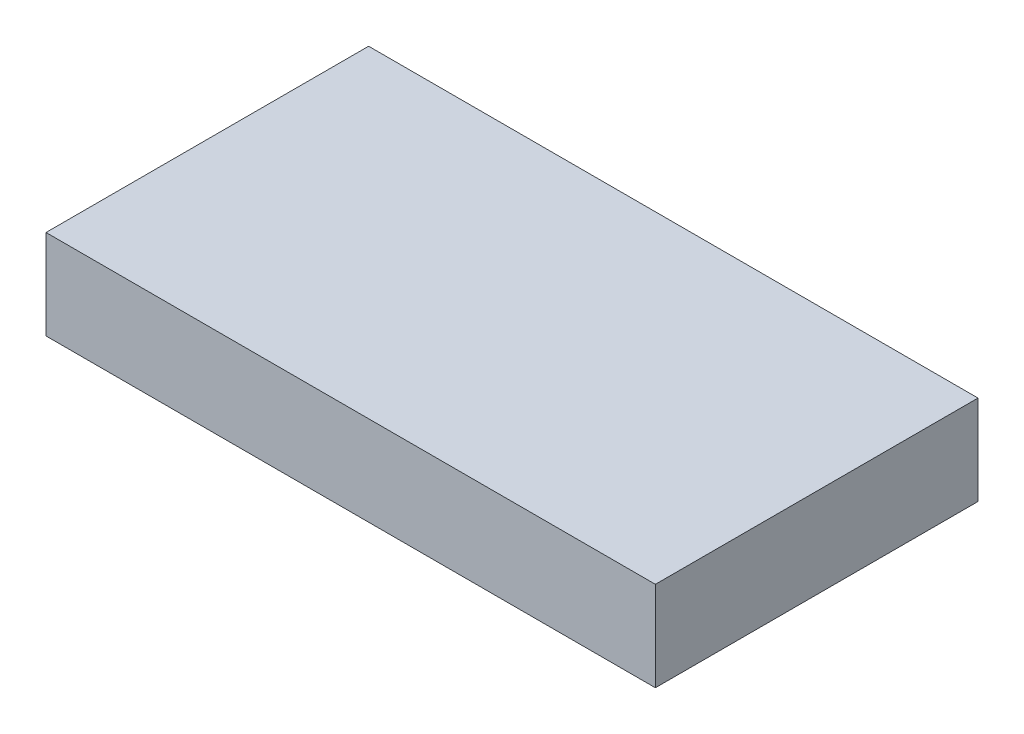
ISO-10303-21;
HEADER;
FILE_DESCRIPTION(('STEP AP214'),'2;1');
FILE_NAME('part.step','',(''),(''),'','','');
FILE_SCHEMA(('AUTOMOTIVE_DESIGN { 1 0 10303 214 1 1 1 1 }'));
ENDSEC;
DATA;
#1=APPLICATION_CONTEXT('core data for automotive mechanical design processes');
#2=APPLICATION_PROTOCOL_DEFINITION('international standard','automotive_design',2000,#1);
#3=PRODUCT_CONTEXT('',#1,'mechanical');
#4=PRODUCT('Part','Part','',(#3));
#5=PRODUCT_RELATED_PRODUCT_CATEGORY('part','',(#4));
#6=PRODUCT_DEFINITION_FORMATION('','',#4);
#7=PRODUCT_DEFINITION_CONTEXT('part definition',#1,'design');
#8=PRODUCT_DEFINITION('design','',#6,#7);
#9=PRODUCT_DEFINITION_SHAPE('','',#8);
#10=(LENGTH_UNIT() NAMED_UNIT(*) SI_UNIT(.MILLI.,.METRE.));
#11=(NAMED_UNIT(*) PLANE_ANGLE_UNIT() SI_UNIT($,.RADIAN.));
#12=(NAMED_UNIT(*) SI_UNIT($,.STERADIAN.) SOLID_ANGLE_UNIT());
#13=UNCERTAINTY_MEASURE_WITH_UNIT(LENGTH_MEASURE(1.E-05),#10,'distance_accuracy_value','');
#14=(GEOMETRIC_REPRESENTATION_CONTEXT(3) GLOBAL_UNCERTAINTY_ASSIGNED_CONTEXT((#13)) GLOBAL_UNIT_ASSIGNED_CONTEXT((#10,
#11,#12)) REPRESENTATION_CONTEXT('',''));
#15=CARTESIAN_POINT('',(0.,0.,0.));
#16=DIRECTION('',(0.,0.,1.));
#17=DIRECTION('',(1.,0.,0.));
#18=AXIS2_PLACEMENT_3D('',#15,#16,#17);
#19=CARTESIAN_POINT('',(107.95,31.75,57.15));
#20=DIRECTION('',(-1.,0.,0.));
#21=DIRECTION('',(0.,0.,1.));
#22=AXIS2_PLACEMENT_3D('',#19,#20,#21);
#23=PLANE('',#22);
#24=DIRECTION('',(0.,0.,-1.));
#25=VECTOR('',#24,1.);
#26=CARTESIAN_POINT('',(107.95,0.,57.15));
#27=LINE('',#26,#25);
#28=CARTESIAN_POINT('',(107.95,0.,57.15));
#29=VERTEX_POINT('',#28);
#30=CARTESIAN_POINT('',(107.95,0.,-57.15));
#31=VERTEX_POINT('',#30);
#32=EDGE_CURVE('E98',#29,#31,#27,.T.);
#33=ORIENTED_EDGE('',*,*,#32,.T.);
#34=DIRECTION('',(0.,-1.,0.));
#35=VECTOR('',#34,1.);
#36=CARTESIAN_POINT('',(107.95,31.75,-57.15));
#37=LINE('',#36,#35);
#38=CARTESIAN_POINT('',(107.95,31.75,-57.15));
#39=VERTEX_POINT('',#38);
#40=EDGE_CURVE('E11',#39,#31,#37,.T.);
#41=ORIENTED_EDGE('',*,*,#40,.F.);
#42=DIRECTION('',(0.,0.,-1.));
#43=VECTOR('',#42,1.);
#44=CARTESIAN_POINT('',(107.95,31.75,57.15));
#45=LINE('',#44,#43);
#46=CARTESIAN_POINT('',(107.95,31.75,57.15));
#47=VERTEX_POINT('',#46);
#48=EDGE_CURVE('E86',#47,#39,#45,.T.);
#49=ORIENTED_EDGE('',*,*,#48,.F.);
#50=DIRECTION('',(0.,-1.,0.));
#51=VECTOR('',#50,1.);
#52=CARTESIAN_POINT('',(107.95,31.75,57.15));
#53=LINE('',#52,#51);
#54=EDGE_CURVE('E94',#47,#29,#53,.T.);
#55=ORIENTED_EDGE('',*,*,#54,.T.);
#56=EDGE_LOOP('',(#33,#41,#49,#55));
#57=FACE_BOUND('',#56,.T.);
#58=ADVANCED_FACE('F35',(#57),#23,.F.);
#59=CARTESIAN_POINT('',(-107.95,31.75,-57.15));
#60=DIRECTION('',(0.,0.,1.));
#61=DIRECTION('',(1.,0.,0.));
#62=AXIS2_PLACEMENT_3D('',#59,#60,#61);
#63=PLANE('',#62);
#64=DIRECTION('',(-1.,0.,0.));
#65=VECTOR('',#64,1.);
#66=CARTESIAN_POINT('',(-107.95,0.,-57.15));
#67=LINE('',#66,#65);
#68=CARTESIAN_POINT('',(-107.95,0.,-57.15));
#69=VERTEX_POINT('',#68);
#70=EDGE_CURVE('E90',#31,#69,#67,.T.);
#71=ORIENTED_EDGE('',*,*,#70,.T.);
#72=DIRECTION('',(0.,-1.,0.));
#73=VECTOR('',#72,1.);
#74=CARTESIAN_POINT('',(-107.95,31.75,-57.15));
#75=LINE('',#74,#73);
#76=CARTESIAN_POINT('',(-107.95,31.75,-57.15));
#77=VERTEX_POINT('',#76);
#78=EDGE_CURVE('E43',#77,#69,#75,.T.);
#79=ORIENTED_EDGE('',*,*,#78,.F.);
#80=DIRECTION('',(-1.,0.,0.));
#81=VECTOR('',#80,1.);
#82=CARTESIAN_POINT('',(-107.95,31.75,-57.15));
#83=LINE('',#82,#81);
#84=EDGE_CURVE('E81',#39,#77,#83,.T.);
#85=ORIENTED_EDGE('',*,*,#84,.F.);
#86=ORIENTED_EDGE('',*,*,#40,.T.);
#87=EDGE_LOOP('',(#71,#79,#85,#86));
#88=FACE_BOUND('',#87,.T.);
#89=ADVANCED_FACE('F89',(#88),#63,.F.);
#90=CARTESIAN_POINT('',(-107.95,31.75,57.15));
#91=DIRECTION('',(1.,0.,0.));
#92=DIRECTION('',(0.,0.,-1.));
#93=AXIS2_PLACEMENT_3D('',#90,#91,#92);
#94=PLANE('',#93);
#95=DIRECTION('',(0.,0.,1.));
#96=VECTOR('',#95,1.);
#97=CARTESIAN_POINT('',(-107.95,0.,57.15));
#98=LINE('',#97,#96);
#99=CARTESIAN_POINT('',(-107.95,0.,57.15));
#100=VERTEX_POINT('',#99);
#101=EDGE_CURVE('E68',#69,#100,#98,.T.);
#102=ORIENTED_EDGE('',*,*,#101,.T.);
#103=DIRECTION('',(0.,-1.,0.));
#104=VECTOR('',#103,1.);
#105=CARTESIAN_POINT('',(-107.95,31.75,57.15));
#106=LINE('',#105,#104);
#107=CARTESIAN_POINT('',(-107.95,31.75,57.15));
#108=VERTEX_POINT('',#107);
#109=EDGE_CURVE('E91',#108,#100,#106,.T.);
#110=ORIENTED_EDGE('',*,*,#109,.F.);
#111=DIRECTION('',(0.,0.,1.));
#112=VECTOR('',#111,1.);
#113=CARTESIAN_POINT('',(-107.95,31.75,57.15));
#114=LINE('',#113,#112);
#115=EDGE_CURVE('E84',#77,#108,#114,.T.);
#116=ORIENTED_EDGE('',*,*,#115,.F.);
#117=ORIENTED_EDGE('',*,*,#78,.T.);
#118=EDGE_LOOP('',(#102,#110,#116,#117));
#119=FACE_BOUND('',#118,.T.);
#120=ADVANCED_FACE('F92',(#119),#94,.F.);
#121=CARTESIAN_POINT('',(-107.95,31.75,57.15));
#122=DIRECTION('',(0.,0.,-1.));
#123=DIRECTION('',(-1.,0.,0.));
#124=AXIS2_PLACEMENT_3D('',#121,#122,#123);
#125=PLANE('',#124);
#126=DIRECTION('',(1.,0.,0.));
#127=VECTOR('',#126,1.);
#128=CARTESIAN_POINT('',(-107.95,0.,57.15));
#129=LINE('',#128,#127);
#130=EDGE_CURVE('E74',#100,#29,#129,.T.);
#131=ORIENTED_EDGE('',*,*,#130,.T.);
#132=ORIENTED_EDGE('',*,*,#54,.F.);
#133=DIRECTION('',(1.,0.,0.));
#134=VECTOR('',#133,1.);
#135=CARTESIAN_POINT('',(-107.95,31.75,57.15));
#136=LINE('',#135,#134);
#137=EDGE_CURVE('E51',#108,#47,#136,.T.);
#138=ORIENTED_EDGE('',*,*,#137,.F.);
#139=ORIENTED_EDGE('',*,*,#109,.T.);
#140=EDGE_LOOP('',(#131,#132,#138,#139));
#141=FACE_BOUND('',#140,.T.);
#142=ADVANCED_FACE('F105',(#141),#125,.F.);
#143=CARTESIAN_POINT('',(0.,31.75,0.));
#144=DIRECTION('',(0.,-1.,0.));
#145=DIRECTION('',(0.,0.,-1.));
#146=AXIS2_PLACEMENT_3D('',#143,#144,#145);
#147=PLANE('',#146);
#148=ORIENTED_EDGE('',*,*,#48,.T.);
#149=ORIENTED_EDGE('',*,*,#84,.T.);
#150=ORIENTED_EDGE('',*,*,#115,.T.);
#151=ORIENTED_EDGE('',*,*,#137,.T.);
#152=EDGE_LOOP('',(#148,#149,#150,#151));
#153=FACE_BOUND('',#152,.T.);
#154=ADVANCED_FACE('F82',(#153),#147,.F.);
#155=CARTESIAN_POINT('',(0.,0.,0.));
#156=DIRECTION('',(0.,-1.,0.));
#157=DIRECTION('',(0.,0.,-1.));
#158=AXIS2_PLACEMENT_3D('',#155,#156,#157);
#159=PLANE('',#158);
#160=ORIENTED_EDGE('',*,*,#32,.F.);
#161=ORIENTED_EDGE('',*,*,#130,.F.);
#162=ORIENTED_EDGE('',*,*,#101,.F.);
#163=ORIENTED_EDGE('',*,*,#70,.F.);
#164=EDGE_LOOP('',(#160,#161,#162,#163));
#165=FACE_BOUND('',#164,.T.);
#166=ADVANCED_FACE('F108',(#165),#159,.T.);
#167=CLOSED_SHELL('',(#58,#89,#120,#142,#154,#166));
#168=MANIFOLD_SOLID_BREP('B2',#167);
#169=ADVANCED_BREP_SHAPE_REPRESENTATION('',(#18,#168),#14);
#170=SHAPE_DEFINITION_REPRESENTATION(#9,#169);
ENDSEC;
END-ISO-10303-21;
